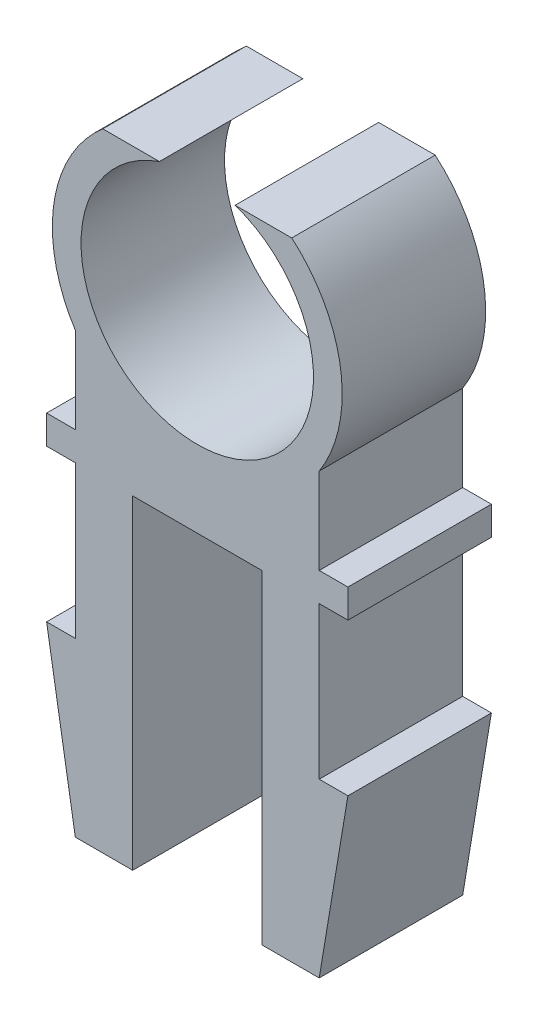
ISO-10303-21;
HEADER;
FILE_DESCRIPTION(('STEP AP214'),'2;1');
FILE_NAME('part.step','',(''),(''),'','','');
FILE_SCHEMA(('AUTOMOTIVE_DESIGN { 1 0 10303 214 1 1 1 1 }'));
ENDSEC;
DATA;
#1=APPLICATION_CONTEXT('core data for automotive mechanical design processes');
#2=APPLICATION_PROTOCOL_DEFINITION('international standard','automotive_design',2000,#1);
#3=PRODUCT_CONTEXT('',#1,'mechanical');
#4=PRODUCT('Part','Part','',(#3));
#5=PRODUCT_RELATED_PRODUCT_CATEGORY('part','',(#4));
#6=PRODUCT_DEFINITION_FORMATION('','',#4);
#7=PRODUCT_DEFINITION_CONTEXT('part definition',#1,'design');
#8=PRODUCT_DEFINITION('design','',#6,#7);
#9=PRODUCT_DEFINITION_SHAPE('','',#8);
#10=(LENGTH_UNIT() NAMED_UNIT(*) SI_UNIT(.MILLI.,.METRE.));
#11=(NAMED_UNIT(*) PLANE_ANGLE_UNIT() SI_UNIT($,.RADIAN.));
#12=(NAMED_UNIT(*) SI_UNIT($,.STERADIAN.) SOLID_ANGLE_UNIT());
#13=UNCERTAINTY_MEASURE_WITH_UNIT(LENGTH_MEASURE(1.E-05),#10,'distance_accuracy_value','');
#14=(GEOMETRIC_REPRESENTATION_CONTEXT(3) GLOBAL_UNCERTAINTY_ASSIGNED_CONTEXT((#13)) GLOBAL_UNIT_ASSIGNED_CONTEXT((#10,
#11,#12)) REPRESENTATION_CONTEXT('',''));
#15=CARTESIAN_POINT('',(0.,0.,0.));
#16=DIRECTION('',(0.,0.,1.));
#17=DIRECTION('',(1.,0.,0.));
#18=AXIS2_PLACEMENT_3D('',#15,#16,#17);
#19=CARTESIAN_POINT('',(0.,-6.72763633939717,2.5));
#20=DIRECTION('',(0.,1.,0.));
#21=DIRECTION('',(-1.,0.,0.));
#22=AXIS2_PLACEMENT_3D('',#19,#20,#21);
#23=PLANE('',#22);
#24=DIRECTION('',(1.,0.,0.));
#25=VECTOR('',#24,1.);
#26=CARTESIAN_POINT('',(0.,-6.72763633939717,-2.5));
#27=LINE('',#26,#25);
#28=CARTESIAN_POINT('',(-5.25,-6.72763633939717,-2.5));
#29=VERTEX_POINT('',#28);
#30=CARTESIAN_POINT('',(-4.24999999999995,-6.72763633939717,-2.5));
#31=VERTEX_POINT('',#30);
#32=EDGE_CURVE('E222',#29,#31,#27,.T.);
#33=ORIENTED_EDGE('',*,*,#32,.T.);
#34=DIRECTION('',(0.,0.,-1.));
#35=VECTOR('',#34,1.);
#36=CARTESIAN_POINT('',(-4.25,-6.72763633939716,0.));
#37=LINE('',#36,#35);
#38=CARTESIAN_POINT('',(-4.24999999999995,-6.72763633939717,2.5));
#39=VERTEX_POINT('',#38);
#40=EDGE_CURVE('E73',#39,#31,#37,.T.);
#41=ORIENTED_EDGE('',*,*,#40,.F.);
#42=DIRECTION('',(1.,0.,0.));
#43=VECTOR('',#42,1.);
#44=CARTESIAN_POINT('',(0.,-6.72763633939717,2.5));
#45=LINE('',#44,#43);
#46=CARTESIAN_POINT('',(-5.25,-6.72763633939717,2.5));
#47=VERTEX_POINT('',#46);
#48=EDGE_CURVE('E416',#47,#39,#45,.T.);
#49=ORIENTED_EDGE('',*,*,#48,.F.);
#50=DIRECTION('',(0.,0.,-1.));
#51=VECTOR('',#50,1.);
#52=CARTESIAN_POINT('',(-5.25,-6.72763633939717,2.5));
#53=LINE('',#52,#51);
#54=EDGE_CURVE('E360',#47,#29,#53,.T.);
#55=ORIENTED_EDGE('',*,*,#54,.T.);
#56=EDGE_LOOP('',(#33,#41,#49,#55));
#57=FACE_BOUND('',#56,.T.);
#58=ADVANCED_FACE('F47',(#57),#23,.F.);
#59=CARTESIAN_POINT('',(-2.2499999999999,-6.72763633939717,2.5));
#60=VERTEX_POINT('',#59);
#61=CARTESIAN_POINT('',(2.24999999999995,-6.72763633939717,2.5));
#62=VERTEX_POINT('',#61);
#63=EDGE_CURVE('E51',#60,#62,#45,.T.);
#64=ORIENTED_EDGE('',*,*,#63,.F.);
#65=DIRECTION('',(0.,0.,1.));
#66=VECTOR('',#65,1.);
#67=CARTESIAN_POINT('',(-2.25,-6.72763633939717,0.));
#68=LINE('',#67,#66);
#69=CARTESIAN_POINT('',(-2.25,-6.72763633939717,-2.5));
#70=VERTEX_POINT('',#69);
#71=EDGE_CURVE('E224',#70,#60,#68,.T.);
#72=ORIENTED_EDGE('',*,*,#71,.F.);
#73=CARTESIAN_POINT('',(2.24999999999995,-6.72763633939717,-2.5));
#74=VERTEX_POINT('',#73);
#75=EDGE_CURVE('E211',#70,#74,#27,.T.);
#76=ORIENTED_EDGE('',*,*,#75,.T.);
#77=DIRECTION('',(0.,0.,-1.));
#78=VECTOR('',#77,1.);
#79=CARTESIAN_POINT('',(2.25,-6.72763633939717,0.));
#80=LINE('',#79,#78);
#81=EDGE_CURVE('E313',#62,#74,#80,.T.);
#82=ORIENTED_EDGE('',*,*,#81,.F.);
#83=EDGE_LOOP('',(#64,#72,#76,#82));
#84=FACE_BOUND('',#83,.T.);
#85=ADVANCED_FACE('F225',(#84),#23,.F.);
#86=DIRECTION('',(0.,0.,1.));
#87=VECTOR('',#86,1.);
#88=CARTESIAN_POINT('',(4.25,-6.72763633939716,0.));
#89=LINE('',#88,#87);
#90=CARTESIAN_POINT('',(4.24999999999998,-6.72763633939717,-2.5));
#91=VERTEX_POINT('',#90);
#92=CARTESIAN_POINT('',(4.24999999999995,-6.72763633939717,2.5));
#93=VERTEX_POINT('',#92);
#94=EDGE_CURVE('E297',#91,#93,#89,.T.);
#95=ORIENTED_EDGE('',*,*,#94,.F.);
#96=CARTESIAN_POINT('',(5.25,-6.72763633939717,-2.5));
#97=VERTEX_POINT('',#96);
#98=EDGE_CURVE('E223',#91,#97,#27,.T.);
#99=ORIENTED_EDGE('',*,*,#98,.T.);
#100=DIRECTION('',(0.,0.,-1.));
#101=VECTOR('',#100,1.);
#102=CARTESIAN_POINT('',(5.25,-6.72763633939717,2.5));
#103=LINE('',#102,#101);
#104=CARTESIAN_POINT('',(5.25,-6.72763633939717,2.5));
#105=VERTEX_POINT('',#104);
#106=EDGE_CURVE('E363',#105,#97,#103,.T.);
#107=ORIENTED_EDGE('',*,*,#106,.F.);
#108=EDGE_CURVE('E302',#93,#105,#45,.T.);
#109=ORIENTED_EDGE('',*,*,#108,.F.);
#110=EDGE_LOOP('',(#95,#99,#107,#109));
#111=FACE_BOUND('',#110,.T.);
#112=ADVANCED_FACE('F535',(#111),#23,.F.);
#113=CARTESIAN_POINT('',(4.25,0.,2.5));
#114=DIRECTION('',(1.,0.,0.));
#115=DIRECTION('',(0.,1.,0.));
#116=AXIS2_PLACEMENT_3D('',#113,#114,#115);
#117=PLANE('',#116);
#118=DIRECTION('',(0.,-1.,0.));
#119=VECTOR('',#118,1.);
#120=CARTESIAN_POINT('',(4.25,0.,-2.5));
#121=LINE('',#120,#119);
#122=CARTESIAN_POINT('',(4.25,-2.72763633939717,-2.5));
#123=VERTEX_POINT('',#122);
#124=CARTESIAN_POINT('',(4.25,-5.72763633939717,-2.5));
#125=VERTEX_POINT('',#124);
#126=EDGE_CURVE('E290',#123,#125,#121,.T.);
#127=ORIENTED_EDGE('',*,*,#126,.F.);
#128=DIRECTION('',(0.,0.,-1.));
#129=VECTOR('',#128,1.);
#130=CARTESIAN_POINT('',(4.25,-2.72763633939717,2.5));
#131=LINE('',#130,#129);
#132=CARTESIAN_POINT('',(4.25,-2.72763633939717,2.5));
#133=VERTEX_POINT('',#132);
#134=EDGE_CURVE('E11',#133,#123,#131,.T.);
#135=ORIENTED_EDGE('',*,*,#134,.F.);
#136=DIRECTION('',(0.,-1.,0.));
#137=VECTOR('',#136,1.);
#138=CARTESIAN_POINT('',(4.25,0.,2.5));
#139=LINE('',#138,#137);
#140=CARTESIAN_POINT('',(4.25,-5.72763633939717,2.5));
#141=VERTEX_POINT('',#140);
#142=EDGE_CURVE('E376',#133,#141,#139,.T.);
#143=ORIENTED_EDGE('',*,*,#142,.T.);
#144=DIRECTION('',(0.,0.,-1.));
#145=VECTOR('',#144,1.);
#146=CARTESIAN_POINT('',(4.25,-5.72763633939717,2.5));
#147=LINE('',#146,#145);
#148=EDGE_CURVE('E370',#141,#125,#147,.T.);
#149=ORIENTED_EDGE('',*,*,#148,.T.);
#150=EDGE_LOOP('',(#127,#135,#143,#149));
#151=FACE_BOUND('',#150,.T.);
#152=ADVANCED_FACE('F49',(#151),#117,.T.);
#153=CARTESIAN_POINT('',(0.,0.,2.5));
#154=DIRECTION('',(0.,0.,-1.));
#155=DIRECTION('',(-1.,0.,0.));
#156=AXIS2_PLACEMENT_3D('',#153,#154,#155);
#157=CYLINDRICAL_SURFACE('',#156,5.05);
#158=CARTESIAN_POINT('',(0.,0.,-2.5));
#159=DIRECTION('',(0.,0.,1.));
#160=DIRECTION('',(1.,0.,0.));
#161=AXIS2_PLACEMENT_3D('',#158,#159,#160);
#162=CIRCLE('',#161,5.05);
#163=CARTESIAN_POINT('',(3.29256752382789,3.82903370330347,-2.5));
#164=VERTEX_POINT('',#163);
#165=EDGE_CURVE('E441',#123,#164,#162,.T.);
#166=ORIENTED_EDGE('',*,*,#165,.T.);
#167=DIRECTION('',(0.,0.,-1.));
#168=VECTOR('',#167,1.);
#169=CARTESIAN_POINT('',(3.29256752382789,3.82903370330347,2.5));
#170=LINE('',#169,#168);
#171=CARTESIAN_POINT('',(3.29256752382789,3.82903370330347,2.5));
#172=VERTEX_POINT('',#171);
#173=EDGE_CURVE('E58',#172,#164,#170,.T.);
#174=ORIENTED_EDGE('',*,*,#173,.F.);
#175=CARTESIAN_POINT('',(0.,0.,2.5));
#176=DIRECTION('',(0.,0.,1.));
#177=DIRECTION('',(1.,0.,0.));
#178=AXIS2_PLACEMENT_3D('',#175,#176,#177);
#179=CIRCLE('',#178,5.05);
#180=EDGE_CURVE('E382',#133,#172,#179,.T.);
#181=ORIENTED_EDGE('',*,*,#180,.F.);
#182=ORIENTED_EDGE('',*,*,#134,.T.);
#183=EDGE_LOOP('',(#166,#174,#181,#182));
#184=FACE_BOUND('',#183,.T.);
#185=ADVANCED_FACE('F508',(#184),#157,.T.);
#186=CARTESIAN_POINT('',(0.,3.82903370330347,2.5));
#187=DIRECTION('',(0.,1.,0.));
#188=DIRECTION('',(-1.,0.,0.));
#189=AXIS2_PLACEMENT_3D('',#186,#187,#188);
#190=PLANE('',#189);
#191=DIRECTION('',(1.,0.,0.));
#192=VECTOR('',#191,1.);
#193=CARTESIAN_POINT('',(0.,3.82903370330347,-2.5));
#194=LINE('',#193,#192);
#195=CARTESIAN_POINT('',(1.31946993105797,3.82903370330347,-2.5));
#196=VERTEX_POINT('',#195);
#197=EDGE_CURVE('E445',#196,#164,#194,.T.);
#198=ORIENTED_EDGE('',*,*,#197,.F.);
#199=DIRECTION('',(0.,0.,-1.));
#200=VECTOR('',#199,1.);
#201=CARTESIAN_POINT('',(1.31946993105797,3.82903370330347,2.5));
#202=LINE('',#201,#200);
#203=CARTESIAN_POINT('',(1.31946993105797,3.82903370330347,2.5));
#204=VERTEX_POINT('',#203);
#205=EDGE_CURVE('E340',#204,#196,#202,.T.);
#206=ORIENTED_EDGE('',*,*,#205,.F.);
#207=DIRECTION('',(1.,0.,0.));
#208=VECTOR('',#207,1.);
#209=CARTESIAN_POINT('',(0.,3.82903370330347,2.5));
#210=LINE('',#209,#208);
#211=EDGE_CURVE('E505',#204,#172,#210,.T.);
#212=ORIENTED_EDGE('',*,*,#211,.T.);
#213=ORIENTED_EDGE('',*,*,#173,.T.);
#214=EDGE_LOOP('',(#198,#206,#212,#213));
#215=FACE_BOUND('',#214,.T.);
#216=ADVANCED_FACE('F501',(#215),#190,.T.);
#217=CARTESIAN_POINT('',(0.,0.,2.5));
#218=DIRECTION('',(0.,0.,-1.));
#219=DIRECTION('',(-1.,0.,0.));
#220=AXIS2_PLACEMENT_3D('',#217,#218,#219);
#221=CYLINDRICAL_SURFACE('',#220,4.05);
#222=CARTESIAN_POINT('',(0.,0.,-2.5));
#223=DIRECTION('',(0.,0.,1.));
#224=DIRECTION('',(1.,0.,0.));
#225=AXIS2_PLACEMENT_3D('',#222,#223,#224);
#226=CIRCLE('',#225,4.05);
#227=CARTESIAN_POINT('',(-1.31946993105797,3.82903370330347,-2.5));
#228=VERTEX_POINT('',#227);
#229=EDGE_CURVE('E449',#228,#196,#226,.T.);
#230=ORIENTED_EDGE('',*,*,#229,.F.);
#231=DIRECTION('',(0.,0.,-1.));
#232=VECTOR('',#231,1.);
#233=CARTESIAN_POINT('',(-1.31946993105797,3.82903370330347,2.5));
#234=LINE('',#233,#232);
#235=CARTESIAN_POINT('',(-1.31946993105797,3.82903370330347,2.5));
#236=VERTEX_POINT('',#235);
#237=EDGE_CURVE('E343',#236,#228,#234,.T.);
#238=ORIENTED_EDGE('',*,*,#237,.F.);
#239=CARTESIAN_POINT('',(0.,0.,2.5));
#240=DIRECTION('',(0.,0.,1.));
#241=DIRECTION('',(1.,0.,0.));
#242=AXIS2_PLACEMENT_3D('',#239,#240,#241);
#243=CIRCLE('',#242,4.05);
#244=EDGE_CURVE('E516',#236,#204,#243,.T.);
#245=ORIENTED_EDGE('',*,*,#244,.T.);
#246=ORIENTED_EDGE('',*,*,#205,.T.);
#247=EDGE_LOOP('',(#230,#238,#245,#246));
#248=FACE_BOUND('',#247,.T.);
#249=ADVANCED_FACE('F496',(#248),#221,.F.);
#250=CARTESIAN_POINT('',(0.,3.82903370330347,2.5));
#251=DIRECTION('',(0.,1.,0.));
#252=DIRECTION('',(-1.,0.,0.));
#253=AXIS2_PLACEMENT_3D('',#250,#251,#252);
#254=PLANE('',#253);
#255=DIRECTION('',(1.,0.,0.));
#256=VECTOR('',#255,1.);
#257=CARTESIAN_POINT('',(0.,3.82903370330347,-2.5));
#258=LINE('',#257,#256);
#259=CARTESIAN_POINT('',(-3.29256752382789,3.82903370330347,-2.5));
#260=VERTEX_POINT('',#259);
#261=EDGE_CURVE('E453',#260,#228,#258,.T.);
#262=ORIENTED_EDGE('',*,*,#261,.F.);
#263=DIRECTION('',(0.,0.,-1.));
#264=VECTOR('',#263,1.);
#265=CARTESIAN_POINT('',(-3.29256752382789,3.82903370330347,2.5));
#266=LINE('',#265,#264);
#267=CARTESIAN_POINT('',(-3.29256752382789,3.82903370330347,2.5));
#268=VERTEX_POINT('',#267);
#269=EDGE_CURVE('E346',#268,#260,#266,.T.);
#270=ORIENTED_EDGE('',*,*,#269,.F.);
#271=DIRECTION('',(1.,0.,0.));
#272=VECTOR('',#271,1.);
#273=CARTESIAN_POINT('',(0.,3.82903370330347,2.5));
#274=LINE('',#273,#272);
#275=EDGE_CURVE('E492',#268,#236,#274,.T.);
#276=ORIENTED_EDGE('',*,*,#275,.T.);
#277=ORIENTED_EDGE('',*,*,#237,.T.);
#278=EDGE_LOOP('',(#262,#270,#276,#277));
#279=FACE_BOUND('',#278,.T.);
#280=ADVANCED_FACE('F489',(#279),#254,.T.);
#281=CARTESIAN_POINT('',(0.,0.,2.5));
#282=DIRECTION('',(0.,0.,-1.));
#283=DIRECTION('',(-1.,0.,0.));
#284=AXIS2_PLACEMENT_3D('',#281,#282,#283);
#285=CYLINDRICAL_SURFACE('',#284,5.05);
#286=CARTESIAN_POINT('',(0.,0.,-2.5));
#287=DIRECTION('',(0.,0.,1.));
#288=DIRECTION('',(1.,0.,0.));
#289=AXIS2_PLACEMENT_3D('',#286,#287,#288);
#290=CIRCLE('',#289,5.05);
#291=CARTESIAN_POINT('',(-4.25,-2.72763633939717,-2.5));
#292=VERTEX_POINT('',#291);
#293=EDGE_CURVE('E457',#260,#292,#290,.T.);
#294=ORIENTED_EDGE('',*,*,#293,.T.);
#295=DIRECTION('',(0.,0.,-1.));
#296=VECTOR('',#295,1.);
#297=CARTESIAN_POINT('',(-4.25,-2.72763633939717,2.5));
#298=LINE('',#297,#296);
#299=CARTESIAN_POINT('',(-4.25,-2.72763633939717,2.5));
#300=VERTEX_POINT('',#299);
#301=EDGE_CURVE('E349',#300,#292,#298,.T.);
#302=ORIENTED_EDGE('',*,*,#301,.F.);
#303=CARTESIAN_POINT('',(0.,0.,2.5));
#304=DIRECTION('',(0.,0.,1.));
#305=DIRECTION('',(1.,0.,0.));
#306=AXIS2_PLACEMENT_3D('',#303,#304,#305);
#307=CIRCLE('',#306,5.05);
#308=EDGE_CURVE('E480',#268,#300,#307,.T.);
#309=ORIENTED_EDGE('',*,*,#308,.F.);
#310=ORIENTED_EDGE('',*,*,#269,.T.);
#311=EDGE_LOOP('',(#294,#302,#309,#310));
#312=FACE_BOUND('',#311,.T.);
#313=ADVANCED_FACE('F556',(#312),#285,.T.);
#314=CARTESIAN_POINT('',(-4.25,0.,2.5));
#315=DIRECTION('',(1.,0.,0.));
#316=DIRECTION('',(0.,1.,0.));
#317=AXIS2_PLACEMENT_3D('',#314,#315,#316);
#318=PLANE('',#317);
#319=DIRECTION('',(0.,-1.,0.));
#320=VECTOR('',#319,1.);
#321=CARTESIAN_POINT('',(-4.25,0.,-2.5));
#322=LINE('',#321,#320);
#323=CARTESIAN_POINT('',(-4.25,-5.72763633939717,-2.5));
#324=VERTEX_POINT('',#323);
#325=EDGE_CURVE('E460',#292,#324,#322,.T.);
#326=ORIENTED_EDGE('',*,*,#325,.T.);
#327=DIRECTION('',(0.,0.,-1.));
#328=VECTOR('',#327,1.);
#329=CARTESIAN_POINT('',(-4.25,-5.72763633939717,2.5));
#330=LINE('',#329,#328);
#331=CARTESIAN_POINT('',(-4.25,-5.72763633939717,2.5));
#332=VERTEX_POINT('',#331);
#333=EDGE_CURVE('E353',#332,#324,#330,.T.);
#334=ORIENTED_EDGE('',*,*,#333,.F.);
#335=DIRECTION('',(0.,-1.,0.));
#336=VECTOR('',#335,1.);
#337=CARTESIAN_POINT('',(-4.25,0.,2.5));
#338=LINE('',#337,#336);
#339=EDGE_CURVE('E428',#300,#332,#338,.T.);
#340=ORIENTED_EDGE('',*,*,#339,.F.);
#341=ORIENTED_EDGE('',*,*,#301,.T.);
#342=EDGE_LOOP('',(#326,#334,#340,#341));
#343=FACE_BOUND('',#342,.T.);
#344=ADVANCED_FACE('F484',(#343),#318,.F.);
#345=CARTESIAN_POINT('',(0.,-5.72763633939717,2.5));
#346=DIRECTION('',(0.,-1.,0.));
#347=DIRECTION('',(0.,0.,-1.));
#348=AXIS2_PLACEMENT_3D('',#345,#346,#347);
#349=PLANE('',#348);
#350=DIRECTION('',(-1.,0.,0.));
#351=VECTOR('',#350,1.);
#352=CARTESIAN_POINT('',(0.,-5.72763633939717,-2.5));
#353=LINE('',#352,#351);
#354=CARTESIAN_POINT('',(-5.25,-5.72763633939717,-2.5));
#355=VERTEX_POINT('',#354);
#356=EDGE_CURVE('E462',#324,#355,#353,.T.);
#357=ORIENTED_EDGE('',*,*,#356,.T.);
#358=DIRECTION('',(0.,0.,-1.));
#359=VECTOR('',#358,1.);
#360=CARTESIAN_POINT('',(-5.25,-5.72763633939717,2.5));
#361=LINE('',#360,#359);
#362=CARTESIAN_POINT('',(-5.25,-5.72763633939717,2.5));
#363=VERTEX_POINT('',#362);
#364=EDGE_CURVE('E357',#363,#355,#361,.T.);
#365=ORIENTED_EDGE('',*,*,#364,.F.);
#366=DIRECTION('',(-1.,0.,0.));
#367=VECTOR('',#366,1.);
#368=CARTESIAN_POINT('',(0.,-5.72763633939717,2.5));
#369=LINE('',#368,#367);
#370=EDGE_CURVE('E423',#332,#363,#369,.T.);
#371=ORIENTED_EDGE('',*,*,#370,.F.);
#372=ORIENTED_EDGE('',*,*,#333,.T.);
#373=EDGE_LOOP('',(#357,#365,#371,#372));
#374=FACE_BOUND('',#373,.T.);
#375=ADVANCED_FACE('F475',(#374),#349,.F.);
#376=CARTESIAN_POINT('',(-5.25,0.,2.5));
#377=DIRECTION('',(-1.,0.,0.));
#378=DIRECTION('',(0.,0.,1.));
#379=AXIS2_PLACEMENT_3D('',#376,#377,#378);
#380=PLANE('',#379);
#381=DIRECTION('',(0.,1.,0.));
#382=VECTOR('',#381,1.);
#383=CARTESIAN_POINT('',(-5.25,0.,-2.5));
#384=LINE('',#383,#382);
#385=EDGE_CURVE('E328',#29,#355,#384,.T.);
#386=ORIENTED_EDGE('',*,*,#385,.F.);
#387=ORIENTED_EDGE('',*,*,#54,.F.);
#388=DIRECTION('',(0.,1.,0.));
#389=VECTOR('',#388,1.);
#390=CARTESIAN_POINT('',(-5.25,0.,2.5));
#391=LINE('',#390,#389);
#392=EDGE_CURVE('E420',#47,#363,#391,.T.);
#393=ORIENTED_EDGE('',*,*,#392,.T.);
#394=ORIENTED_EDGE('',*,*,#364,.T.);
#395=EDGE_LOOP('',(#386,#387,#393,#394));
#396=FACE_BOUND('',#395,.T.);
#397=ADVANCED_FACE('F473',(#396),#380,.T.);
#398=CARTESIAN_POINT('',(5.25,0.,2.5));
#399=DIRECTION('',(-1.,0.,0.));
#400=DIRECTION('',(0.,0.,1.));
#401=AXIS2_PLACEMENT_3D('',#398,#399,#400);
#402=PLANE('',#401);
#403=DIRECTION('',(0.,1.,0.));
#404=VECTOR('',#403,1.);
#405=CARTESIAN_POINT('',(5.25,0.,-2.5));
#406=LINE('',#405,#404);
#407=CARTESIAN_POINT('',(5.25,-5.72763633939717,-2.5));
#408=VERTEX_POINT('',#407);
#409=EDGE_CURVE('E330',#97,#408,#406,.T.);
#410=ORIENTED_EDGE('',*,*,#409,.T.);
#411=DIRECTION('',(0.,0.,-1.));
#412=VECTOR('',#411,1.);
#413=CARTESIAN_POINT('',(5.25,-5.72763633939717,2.5));
#414=LINE('',#413,#412);
#415=CARTESIAN_POINT('',(5.25,-5.72763633939717,2.5));
#416=VERTEX_POINT('',#415);
#417=EDGE_CURVE('E367',#416,#408,#414,.T.);
#418=ORIENTED_EDGE('',*,*,#417,.F.);
#419=DIRECTION('',(0.,1.,0.));
#420=VECTOR('',#419,1.);
#421=CARTESIAN_POINT('',(5.25,0.,2.5));
#422=LINE('',#421,#420);
#423=EDGE_CURVE('E419',#105,#416,#422,.T.);
#424=ORIENTED_EDGE('',*,*,#423,.F.);
#425=ORIENTED_EDGE('',*,*,#106,.T.);
#426=EDGE_LOOP('',(#410,#418,#424,#425));
#427=FACE_BOUND('',#426,.T.);
#428=ADVANCED_FACE('F386',(#427),#402,.F.);
#429=CARTESIAN_POINT('',(0.,-5.72763633939717,2.5));
#430=DIRECTION('',(0.,1.,0.));
#431=DIRECTION('',(0.,0.,1.));
#432=AXIS2_PLACEMENT_3D('',#429,#430,#431);
#433=PLANE('',#432);
#434=DIRECTION('',(1.,0.,0.));
#435=VECTOR('',#434,1.);
#436=CARTESIAN_POINT('',(0.,-5.72763633939717,-2.5));
#437=LINE('',#436,#435);
#438=EDGE_CURVE('E373',#125,#408,#437,.T.);
#439=ORIENTED_EDGE('',*,*,#438,.F.);
#440=ORIENTED_EDGE('',*,*,#148,.F.);
#441=DIRECTION('',(1.,0.,0.));
#442=VECTOR('',#441,1.);
#443=CARTESIAN_POINT('',(0.,-5.72763633939717,2.5));
#444=LINE('',#443,#442);
#445=EDGE_CURVE('E372',#141,#416,#444,.T.);
#446=ORIENTED_EDGE('',*,*,#445,.T.);
#447=ORIENTED_EDGE('',*,*,#417,.T.);
#448=EDGE_LOOP('',(#439,#440,#446,#447));
#449=FACE_BOUND('',#448,.T.);
#450=ADVANCED_FACE('F512',(#449),#433,.T.);
#451=CARTESIAN_POINT('',(0.,0.,2.5));
#452=DIRECTION('',(0.,0.,1.));
#453=DIRECTION('',(1.,0.,0.));
#454=AXIS2_PLACEMENT_3D('',#451,#452,#453);
#455=PLANE('',#454);
#456=ORIENTED_EDGE('',*,*,#142,.F.);
#457=ORIENTED_EDGE('',*,*,#180,.T.);
#458=ORIENTED_EDGE('',*,*,#211,.F.);
#459=ORIENTED_EDGE('',*,*,#244,.F.);
#460=ORIENTED_EDGE('',*,*,#275,.F.);
#461=ORIENTED_EDGE('',*,*,#308,.T.);
#462=ORIENTED_EDGE('',*,*,#339,.T.);
#463=ORIENTED_EDGE('',*,*,#370,.T.);
#464=ORIENTED_EDGE('',*,*,#392,.F.);
#465=ORIENTED_EDGE('',*,*,#48,.T.);
#466=DIRECTION('',(0.,-1.,0.));
#467=VECTOR('',#466,1.);
#468=CARTESIAN_POINT('',(-4.25,-18.0276363393972,2.5));
#469=LINE('',#468,#467);
#470=CARTESIAN_POINT('',(-4.25,-12.0276363393972,2.5));
#471=VERTEX_POINT('',#470);
#472=EDGE_CURVE('E956',#39,#471,#469,.T.);
#473=ORIENTED_EDGE('',*,*,#472,.T.);
#474=DIRECTION('',(-1.,0.,0.));
#475=VECTOR('',#474,1.);
#476=CARTESIAN_POINT('',(-2.25,-12.0276363393972,2.5));
#477=LINE('',#476,#475);
#478=CARTESIAN_POINT('',(-5.25,-12.0276363393972,2.5));
#479=VERTEX_POINT('',#478);
#480=EDGE_CURVE('E949',#471,#479,#477,.T.);
#481=ORIENTED_EDGE('',*,*,#480,.T.);
#482=DIRECTION('',(0.164398987305357,-0.986393923832144,0.));
#483=VECTOR('',#482,1.);
#484=CARTESIAN_POINT('',(-4.19594594594594,-18.3519606637215,2.5));
#485=LINE('',#484,#483);
#486=CARTESIAN_POINT('',(-4.25,-18.0276363393972,2.5));
#487=VERTEX_POINT('',#486);
#488=EDGE_CURVE('E231',#479,#487,#485,.T.);
#489=ORIENTED_EDGE('',*,*,#488,.T.);
#490=DIRECTION('',(-1.,0.,0.));
#491=VECTOR('',#490,1.);
#492=CARTESIAN_POINT('',(-2.25,-18.0276363393972,2.5));
#493=LINE('',#492,#491);
#494=CARTESIAN_POINT('',(-2.25,-18.0276363393972,2.5));
#495=VERTEX_POINT('',#494);
#496=EDGE_CURVE('E975',#495,#487,#493,.T.);
#497=ORIENTED_EDGE('',*,*,#496,.F.);
#498=DIRECTION('',(0.,1.,0.));
#499=VECTOR('',#498,1.);
#500=CARTESIAN_POINT('',(-2.25,-18.0276363393972,2.5));
#501=LINE('',#500,#499);
#502=EDGE_CURVE('E246',#495,#60,#501,.T.);
#503=ORIENTED_EDGE('',*,*,#502,.T.);
#504=ORIENTED_EDGE('',*,*,#63,.T.);
#505=DIRECTION('',(0.,1.,0.));
#506=VECTOR('',#505,1.);
#507=CARTESIAN_POINT('',(2.25,-18.0276363393972,2.5));
#508=LINE('',#507,#506);
#509=CARTESIAN_POINT('',(2.25,-18.0276363393972,2.5));
#510=VERTEX_POINT('',#509);
#511=EDGE_CURVE('E253',#510,#62,#508,.T.);
#512=ORIENTED_EDGE('',*,*,#511,.F.);
#513=DIRECTION('',(1.,0.,0.));
#514=VECTOR('',#513,1.);
#515=CARTESIAN_POINT('',(2.25,-18.0276363393972,2.5));
#516=LINE('',#515,#514);
#517=CARTESIAN_POINT('',(4.25,-18.0276363393972,2.5));
#518=VERTEX_POINT('',#517);
#519=EDGE_CURVE('E274',#510,#518,#516,.T.);
#520=ORIENTED_EDGE('',*,*,#519,.T.);
#521=DIRECTION('',(-0.164398987305357,-0.986393923832144,0.));
#522=VECTOR('',#521,1.);
#523=CARTESIAN_POINT('',(4.19594594594594,-18.3519606637215,2.5));
#524=LINE('',#523,#522);
#525=CARTESIAN_POINT('',(5.25,-12.0276363393972,2.5));
#526=VERTEX_POINT('',#525);
#527=EDGE_CURVE('E258',#526,#518,#524,.T.);
#528=ORIENTED_EDGE('',*,*,#527,.F.);
#529=DIRECTION('',(1.,0.,0.));
#530=VECTOR('',#529,1.);
#531=CARTESIAN_POINT('',(2.25,-12.0276363393972,2.5));
#532=LINE('',#531,#530);
#533=CARTESIAN_POINT('',(4.25,-12.0276363393972,2.5));
#534=VERTEX_POINT('',#533);
#535=EDGE_CURVE('E254',#534,#526,#532,.T.);
#536=ORIENTED_EDGE('',*,*,#535,.F.);
#537=DIRECTION('',(0.,-1.,0.));
#538=VECTOR('',#537,1.);
#539=CARTESIAN_POINT('',(4.25,-18.0276363393972,2.5));
#540=LINE('',#539,#538);
#541=EDGE_CURVE('E291',#93,#534,#540,.T.);
#542=ORIENTED_EDGE('',*,*,#541,.F.);
#543=ORIENTED_EDGE('',*,*,#108,.T.);
#544=ORIENTED_EDGE('',*,*,#423,.T.);
#545=ORIENTED_EDGE('',*,*,#445,.F.);
#546=EDGE_LOOP('',(#456,#457,#458,#459,#460,#461,#462,#463,#464,#465,#473,#481,#489,#497,#503,
#504,#512,#520,#528,#536,#542,#543,#544,#545));
#547=FACE_BOUND('',#546,.T.);
#548=ADVANCED_FACE('F413',(#547),#455,.T.);
#549=CARTESIAN_POINT('',(0.,0.,-2.5));
#550=DIRECTION('',(0.,0.,1.));
#551=DIRECTION('',(1.,0.,0.));
#552=AXIS2_PLACEMENT_3D('',#549,#550,#551);
#553=PLANE('',#552);
#554=ORIENTED_EDGE('',*,*,#126,.T.);
#555=ORIENTED_EDGE('',*,*,#438,.T.);
#556=ORIENTED_EDGE('',*,*,#409,.F.);
#557=ORIENTED_EDGE('',*,*,#98,.F.);
#558=DIRECTION('',(0.,1.,0.));
#559=VECTOR('',#558,1.);
#560=CARTESIAN_POINT('',(4.25,-18.0276363393972,-2.5));
#561=LINE('',#560,#559);
#562=CARTESIAN_POINT('',(4.25,-12.0276363393972,-2.5));
#563=VERTEX_POINT('',#562);
#564=EDGE_CURVE('E278',#563,#91,#561,.T.);
#565=ORIENTED_EDGE('',*,*,#564,.F.);
#566=DIRECTION('',(1.,0.,0.));
#567=VECTOR('',#566,1.);
#568=CARTESIAN_POINT('',(4.25,-12.0276363393972,-2.5));
#569=LINE('',#568,#567);
#570=CARTESIAN_POINT('',(5.25,-12.0276363393972,-2.5));
#571=VERTEX_POINT('',#570);
#572=EDGE_CURVE('E249',#563,#571,#569,.T.);
#573=ORIENTED_EDGE('',*,*,#572,.T.);
#574=DIRECTION('',(0.164398987305357,0.986393923832144,0.));
#575=VECTOR('',#574,1.);
#576=CARTESIAN_POINT('',(4.19594594594594,-18.3519606637215,-2.5));
#577=LINE('',#576,#575);
#578=CARTESIAN_POINT('',(4.25,-18.0276363393972,-2.5));
#579=VERTEX_POINT('',#578);
#580=EDGE_CURVE('E263',#579,#571,#577,.T.);
#581=ORIENTED_EDGE('',*,*,#580,.F.);
#582=DIRECTION('',(1.,0.,0.));
#583=VECTOR('',#582,1.);
#584=CARTESIAN_POINT('',(2.25,-18.0276363393972,-2.5));
#585=LINE('',#584,#583);
#586=CARTESIAN_POINT('',(2.25,-18.0276363393972,-2.5));
#587=VERTEX_POINT('',#586);
#588=EDGE_CURVE('E259',#587,#579,#585,.T.);
#589=ORIENTED_EDGE('',*,*,#588,.F.);
#590=DIRECTION('',(0.,-1.,0.));
#591=VECTOR('',#590,1.);
#592=CARTESIAN_POINT('',(2.25,-18.0276363393972,-2.5));
#593=LINE('',#592,#591);
#594=EDGE_CURVE('E219',#74,#587,#593,.T.);
#595=ORIENTED_EDGE('',*,*,#594,.F.);
#596=ORIENTED_EDGE('',*,*,#75,.F.);
#597=DIRECTION('',(0.,-1.,0.));
#598=VECTOR('',#597,1.);
#599=CARTESIAN_POINT('',(-2.25,-18.0276363393972,-2.5));
#600=LINE('',#599,#598);
#601=CARTESIAN_POINT('',(-2.25,-18.0276363393972,-2.5));
#602=VERTEX_POINT('',#601);
#603=EDGE_CURVE('E216',#70,#602,#600,.T.);
#604=ORIENTED_EDGE('',*,*,#603,.T.);
#605=DIRECTION('',(-1.,0.,0.));
#606=VECTOR('',#605,1.);
#607=CARTESIAN_POINT('',(-2.25,-18.0276363393972,-2.5));
#608=LINE('',#607,#606);
#609=CARTESIAN_POINT('',(-4.25,-18.0276363393972,-2.5));
#610=VERTEX_POINT('',#609);
#611=EDGE_CURVE('E237',#602,#610,#608,.T.);
#612=ORIENTED_EDGE('',*,*,#611,.T.);
#613=DIRECTION('',(-0.164398987305357,0.986393923832144,0.));
#614=VECTOR('',#613,1.);
#615=CARTESIAN_POINT('',(-4.19594594594594,-18.3519606637215,-2.5));
#616=LINE('',#615,#614);
#617=CARTESIAN_POINT('',(-5.25,-12.0276363393972,-2.5));
#618=VERTEX_POINT('',#617);
#619=EDGE_CURVE('E241',#610,#618,#616,.T.);
#620=ORIENTED_EDGE('',*,*,#619,.T.);
#621=DIRECTION('',(-1.,0.,0.));
#622=VECTOR('',#621,1.);
#623=CARTESIAN_POINT('',(-4.25,-12.0276363393972,-2.5));
#624=LINE('',#623,#622);
#625=CARTESIAN_POINT('',(-4.25,-12.0276363393972,-2.5));
#626=VERTEX_POINT('',#625);
#627=EDGE_CURVE('E961',#626,#618,#624,.T.);
#628=ORIENTED_EDGE('',*,*,#627,.F.);
#629=DIRECTION('',(0.,1.,0.));
#630=VECTOR('',#629,1.);
#631=CARTESIAN_POINT('',(-4.25,-18.0276363393972,-2.5));
#632=LINE('',#631,#630);
#633=EDGE_CURVE('E230',#626,#31,#632,.T.);
#634=ORIENTED_EDGE('',*,*,#633,.T.);
#635=ORIENTED_EDGE('',*,*,#32,.F.);
#636=ORIENTED_EDGE('',*,*,#385,.T.);
#637=ORIENTED_EDGE('',*,*,#356,.F.);
#638=ORIENTED_EDGE('',*,*,#325,.F.);
#639=ORIENTED_EDGE('',*,*,#293,.F.);
#640=ORIENTED_EDGE('',*,*,#261,.T.);
#641=ORIENTED_EDGE('',*,*,#229,.T.);
#642=ORIENTED_EDGE('',*,*,#197,.T.);
#643=ORIENTED_EDGE('',*,*,#165,.F.);
#644=EDGE_LOOP('',(#554,#555,#556,#557,#565,#573,#581,#589,#595,#596,#604,#612,#620,#628,#634,
#635,#636,#637,#638,#639,#640,#641,#642,#643));
#645=FACE_BOUND('',#644,.T.);
#646=ADVANCED_FACE('F213',(#645),#553,.F.);
#647=CARTESIAN_POINT('',(2.25,-18.0276363393972,0.));
#648=DIRECTION('',(0.,-1.,0.));
#649=DIRECTION('',(1.,0.,0.));
#650=AXIS2_PLACEMENT_3D('',#647,#648,#649);
#651=PLANE('',#650);
#652=ORIENTED_EDGE('',*,*,#519,.F.);
#653=DIRECTION('',(0.,0.,1.));
#654=VECTOR('',#653,1.);
#655=CARTESIAN_POINT('',(2.25,-18.0276363393972,0.));
#656=LINE('',#655,#654);
#657=EDGE_CURVE('E279',#587,#510,#656,.T.);
#658=ORIENTED_EDGE('',*,*,#657,.F.);
#659=ORIENTED_EDGE('',*,*,#588,.T.);
#660=DIRECTION('',(0.,0.,-1.));
#661=VECTOR('',#660,1.);
#662=CARTESIAN_POINT('',(4.25,-18.0276363393972,0.));
#663=LINE('',#662,#661);
#664=EDGE_CURVE('E267',#518,#579,#663,.T.);
#665=ORIENTED_EDGE('',*,*,#664,.F.);
#666=EDGE_LOOP('',(#652,#658,#659,#665));
#667=FACE_BOUND('',#666,.T.);
#668=ADVANCED_FACE('F407',(#667),#651,.T.);
#669=CARTESIAN_POINT('',(4.25,-18.0276363393972,0.));
#670=DIRECTION('',(0.986393923832144,-0.164398987305357,0.));
#671=DIRECTION('',(0.164398987305357,0.986393923832144,0.));
#672=AXIS2_PLACEMENT_3D('',#669,#670,#671);
#673=PLANE('',#672);
#674=DIRECTION('',(0.,0.,1.));
#675=VECTOR('',#674,1.);
#676=CARTESIAN_POINT('',(5.25,-12.0276363393972,0.));
#677=LINE('',#676,#675);
#678=EDGE_CURVE('E255',#571,#526,#677,.T.);
#679=ORIENTED_EDGE('',*,*,#678,.T.);
#680=ORIENTED_EDGE('',*,*,#527,.T.);
#681=ORIENTED_EDGE('',*,*,#664,.T.);
#682=ORIENTED_EDGE('',*,*,#580,.T.);
#683=EDGE_LOOP('',(#679,#680,#681,#682));
#684=FACE_BOUND('',#683,.T.);
#685=ADVANCED_FACE('F404',(#684),#673,.T.);
#686=CARTESIAN_POINT('',(4.25,-12.0276363393972,0.));
#687=DIRECTION('',(0.,1.,0.));
#688=DIRECTION('',(-1.,0.,0.));
#689=AXIS2_PLACEMENT_3D('',#686,#687,#688);
#690=PLANE('',#689);
#691=ORIENTED_EDGE('',*,*,#535,.T.);
#692=ORIENTED_EDGE('',*,*,#678,.F.);
#693=ORIENTED_EDGE('',*,*,#572,.F.);
#694=DIRECTION('',(0.,0.,-1.));
#695=VECTOR('',#694,1.);
#696=CARTESIAN_POINT('',(4.25,-12.0276363393972,0.));
#697=LINE('',#696,#695);
#698=EDGE_CURVE('E286',#534,#563,#697,.T.);
#699=ORIENTED_EDGE('',*,*,#698,.F.);
#700=EDGE_LOOP('',(#691,#692,#693,#699));
#701=FACE_BOUND('',#700,.T.);
#702=ADVANCED_FACE('F400',(#701),#690,.T.);
#703=CARTESIAN_POINT('',(2.25,-18.0276363393972,0.));
#704=DIRECTION('',(-1.,0.,0.));
#705=DIRECTION('',(0.,0.,1.));
#706=AXIS2_PLACEMENT_3D('',#703,#704,#705);
#707=PLANE('',#706);
#708=ORIENTED_EDGE('',*,*,#511,.T.);
#709=ORIENTED_EDGE('',*,*,#81,.T.);
#710=ORIENTED_EDGE('',*,*,#594,.T.);
#711=ORIENTED_EDGE('',*,*,#657,.T.);
#712=EDGE_LOOP('',(#708,#709,#710,#711));
#713=FACE_BOUND('',#712,.T.);
#714=ADVANCED_FACE('F410',(#713),#707,.T.);
#715=CARTESIAN_POINT('',(4.24999999999995,487.622363660603,0.));
#716=DIRECTION('',(1.,0.,0.));
#717=DIRECTION('',(0.,0.,-1.));
#718=AXIS2_PLACEMENT_3D('',#715,#716,#717);
#719=PLANE('',#718);
#720=ORIENTED_EDGE('',*,*,#564,.T.);
#721=ORIENTED_EDGE('',*,*,#94,.T.);
#722=ORIENTED_EDGE('',*,*,#541,.T.);
#723=ORIENTED_EDGE('',*,*,#698,.T.);
#724=EDGE_LOOP('',(#720,#721,#722,#723));
#725=FACE_BOUND('',#724,.T.);
#726=ADVANCED_FACE('F395',(#725),#719,.T.);
#727=CARTESIAN_POINT('',(-4.24999999999995,487.622363660603,0.));
#728=DIRECTION('',(-1.,0.,0.));
#729=DIRECTION('',(0.,0.,-1.));
#730=AXIS2_PLACEMENT_3D('',#727,#728,#729);
#731=PLANE('',#730);
#732=ORIENTED_EDGE('',*,*,#472,.F.);
#733=ORIENTED_EDGE('',*,*,#40,.T.);
#734=ORIENTED_EDGE('',*,*,#633,.F.);
#735=DIRECTION('',(0.,0.,-1.));
#736=VECTOR('',#735,1.);
#737=CARTESIAN_POINT('',(-4.25,-12.0276363393972,0.));
#738=LINE('',#737,#736);
#739=EDGE_CURVE('E952',#471,#626,#738,.T.);
#740=ORIENTED_EDGE('',*,*,#739,.F.);
#741=EDGE_LOOP('',(#732,#733,#734,#740));
#742=FACE_BOUND('',#741,.T.);
#743=ADVANCED_FACE('F632',(#742),#731,.T.);
#744=CARTESIAN_POINT('',(-2.25,-18.0276363393972,0.));
#745=DIRECTION('',(1.,0.,0.));
#746=DIRECTION('',(0.,0.,1.));
#747=AXIS2_PLACEMENT_3D('',#744,#745,#746);
#748=PLANE('',#747);
#749=ORIENTED_EDGE('',*,*,#603,.F.);
#750=ORIENTED_EDGE('',*,*,#71,.T.);
#751=ORIENTED_EDGE('',*,*,#502,.F.);
#752=DIRECTION('',(0.,0.,1.));
#753=VECTOR('',#752,1.);
#754=CARTESIAN_POINT('',(-2.25,-18.0276363393972,0.));
#755=LINE('',#754,#753);
#756=EDGE_CURVE('E234',#602,#495,#755,.T.);
#757=ORIENTED_EDGE('',*,*,#756,.F.);
#758=EDGE_LOOP('',(#749,#750,#751,#757));
#759=FACE_BOUND('',#758,.T.);
#760=ADVANCED_FACE('F233',(#759),#748,.T.);
#761=CARTESIAN_POINT('',(-2.25,-18.0276363393972,0.));
#762=DIRECTION('',(0.,-1.,0.));
#763=DIRECTION('',(-1.,0.,0.));
#764=AXIS2_PLACEMENT_3D('',#761,#762,#763);
#765=PLANE('',#764);
#766=ORIENTED_EDGE('',*,*,#496,.T.);
#767=DIRECTION('',(0.,0.,-1.));
#768=VECTOR('',#767,1.);
#769=CARTESIAN_POINT('',(-4.25,-18.0276363393972,0.));
#770=LINE('',#769,#768);
#771=EDGE_CURVE('E966',#487,#610,#770,.T.);
#772=ORIENTED_EDGE('',*,*,#771,.T.);
#773=ORIENTED_EDGE('',*,*,#611,.F.);
#774=ORIENTED_EDGE('',*,*,#756,.T.);
#775=EDGE_LOOP('',(#766,#772,#773,#774));
#776=FACE_BOUND('',#775,.T.);
#777=ADVANCED_FACE('F650',(#776),#765,.T.);
#778=CARTESIAN_POINT('',(-4.25,-18.0276363393972,0.));
#779=DIRECTION('',(-0.986393923832144,-0.164398987305357,0.));
#780=DIRECTION('',(-0.164398987305357,0.986393923832144,0.));
#781=AXIS2_PLACEMENT_3D('',#778,#779,#780);
#782=PLANE('',#781);
#783=DIRECTION('',(0.,0.,1.));
#784=VECTOR('',#783,1.);
#785=CARTESIAN_POINT('',(-5.25,-12.0276363393972,0.));
#786=LINE('',#785,#784);
#787=EDGE_CURVE('E283',#618,#479,#786,.T.);
#788=ORIENTED_EDGE('',*,*,#787,.F.);
#789=ORIENTED_EDGE('',*,*,#619,.F.);
#790=ORIENTED_EDGE('',*,*,#771,.F.);
#791=ORIENTED_EDGE('',*,*,#488,.F.);
#792=EDGE_LOOP('',(#788,#789,#790,#791));
#793=FACE_BOUND('',#792,.T.);
#794=ADVANCED_FACE('F659',(#793),#782,.T.);
#795=CARTESIAN_POINT('',(-4.25,-12.0276363393972,0.));
#796=DIRECTION('',(0.,1.,0.));
#797=DIRECTION('',(1.,0.,0.));
#798=AXIS2_PLACEMENT_3D('',#795,#796,#797);
#799=PLANE('',#798);
#800=ORIENTED_EDGE('',*,*,#480,.F.);
#801=ORIENTED_EDGE('',*,*,#739,.T.);
#802=ORIENTED_EDGE('',*,*,#627,.T.);
#803=ORIENTED_EDGE('',*,*,#787,.T.);
#804=EDGE_LOOP('',(#800,#801,#802,#803));
#805=FACE_BOUND('',#804,.T.);
#806=ADVANCED_FACE('F669',(#805),#799,.T.);
#807=CLOSED_SHELL('',(#58,#85,#112,#152,#185,#216,#249,#280,#313,#344,#375,#397,#428,#450,#548,
#646,#668,#685,#702,#714,#726,#743,#760,#777,#794,#806));
#808=MANIFOLD_SOLID_BREP('B2',#807);
#809=ADVANCED_BREP_SHAPE_REPRESENTATION('',(#18,#808),#14);
#810=SHAPE_DEFINITION_REPRESENTATION(#9,#809);
ENDSEC;
END-ISO-10303-21;
